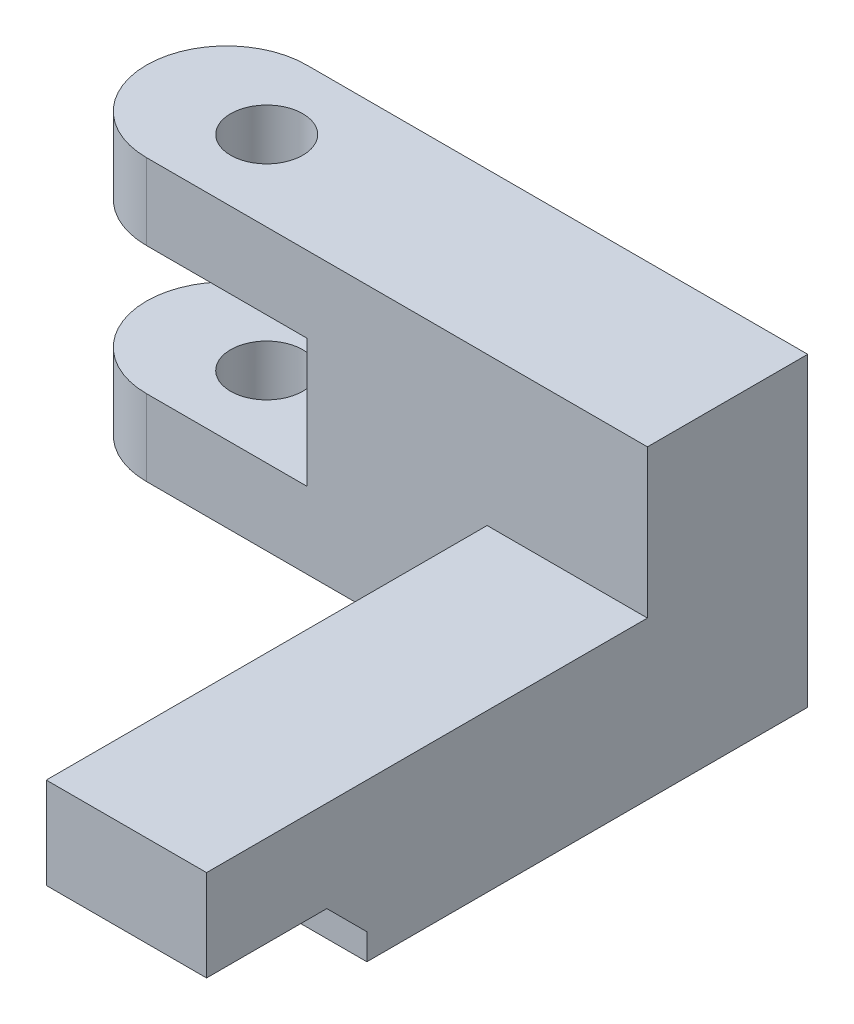
ISO-10303-21;
HEADER;
FILE_DESCRIPTION(('STEP AP214'),'2;1');
FILE_NAME('part.step','',(''),(''),'','','');
FILE_SCHEMA(('AUTOMOTIVE_DESIGN { 1 0 10303 214 1 1 1 1 }'));
ENDSEC;
DATA;
#1=APPLICATION_CONTEXT('core data for automotive mechanical design processes');
#2=APPLICATION_PROTOCOL_DEFINITION('international standard','automotive_design',2000,#1);
#3=PRODUCT_CONTEXT('',#1,'mechanical');
#4=PRODUCT('Part','Part','',(#3));
#5=PRODUCT_RELATED_PRODUCT_CATEGORY('part','',(#4));
#6=PRODUCT_DEFINITION_FORMATION('','',#4);
#7=PRODUCT_DEFINITION_CONTEXT('part definition',#1,'design');
#8=PRODUCT_DEFINITION('design','',#6,#7);
#9=PRODUCT_DEFINITION_SHAPE('','',#8);
#10=(LENGTH_UNIT() NAMED_UNIT(*) SI_UNIT(.MILLI.,.METRE.));
#11=(NAMED_UNIT(*) PLANE_ANGLE_UNIT() SI_UNIT($,.RADIAN.));
#12=(NAMED_UNIT(*) SI_UNIT($,.STERADIAN.) SOLID_ANGLE_UNIT());
#13=UNCERTAINTY_MEASURE_WITH_UNIT(LENGTH_MEASURE(1.E-05),#10,'distance_accuracy_value','');
#14=(GEOMETRIC_REPRESENTATION_CONTEXT(3) GLOBAL_UNCERTAINTY_ASSIGNED_CONTEXT((#13)) GLOBAL_UNIT_ASSIGNED_CONTEXT((#10,
#11,#12)) REPRESENTATION_CONTEXT('',''));
#15=CARTESIAN_POINT('',(0.,0.,0.));
#16=DIRECTION('',(0.,0.,1.));
#17=DIRECTION('',(1.,0.,0.));
#18=AXIS2_PLACEMENT_3D('',#15,#16,#17);
#19=CARTESIAN_POINT('',(1.49694147533203,7.,2.));
#20=DIRECTION('',(0.,-1.,0.));
#21=DIRECTION('',(0.,0.,-1.));
#22=AXIS2_PLACEMENT_3D('',#19,#20,#21);
#23=CYLINDRICAL_SURFACE('',#22,2.);
#24=DIRECTION('',(0.,-1.,0.));
#25=VECTOR('',#24,1.);
#26=CARTESIAN_POINT('',(1.49694147533203,7.,0.));
#27=LINE('',#26,#25);
#28=CARTESIAN_POINT('',(1.49694147533203,7.,0.));
#29=VERTEX_POINT('',#28);
#30=CARTESIAN_POINT('',(1.49694147533203,5.1,0.));
#31=VERTEX_POINT('',#30);
#32=EDGE_CURVE('E256',#29,#31,#27,.T.);
#33=ORIENTED_EDGE('',*,*,#32,.T.);
#34=CARTESIAN_POINT('',(1.49694147533203,5.1,2.));
#35=DIRECTION('',(0.,1.,0.));
#36=DIRECTION('',(-1.,0.,0.));
#37=AXIS2_PLACEMENT_3D('',#34,#35,#36);
#38=CIRCLE('',#37,2.);
#39=CARTESIAN_POINT('',(1.49694147533203,5.1,4.));
#40=VERTEX_POINT('',#39);
#41=EDGE_CURVE('E205',#40,#31,#38,.F.);
#42=ORIENTED_EDGE('',*,*,#41,.F.);
#43=DIRECTION('',(0.,-1.,0.));
#44=VECTOR('',#43,1.);
#45=CARTESIAN_POINT('',(1.49694147533203,7.,4.));
#46=LINE('',#45,#44);
#47=CARTESIAN_POINT('',(1.49694147533203,7.,4.));
#48=VERTEX_POINT('',#47);
#49=EDGE_CURVE('E43',#48,#40,#46,.T.);
#50=ORIENTED_EDGE('',*,*,#49,.F.);
#51=CARTESIAN_POINT('',(1.49694147533203,7.,2.));
#52=DIRECTION('',(0.,1.,0.));
#53=DIRECTION('',(0.,0.,-1.));
#54=AXIS2_PLACEMENT_3D('',#51,#52,#53);
#55=CIRCLE('',#54,2.);
#56=EDGE_CURVE('E239',#29,#48,#55,.T.);
#57=ORIENTED_EDGE('',*,*,#56,.F.);
#58=EDGE_LOOP('',(#33,#42,#50,#57));
#59=FACE_BOUND('',#58,.T.);
#60=ADVANCED_FACE('F39',(#59),#23,.T.);
#61=CARTESIAN_POINT('',(2.49694147533203,7.,2.));
#62=DIRECTION('',(0.,-1.,0.));
#63=DIRECTION('',(0.,0.,-1.));
#64=AXIS2_PLACEMENT_3D('',#61,#62,#63);
#65=CYLINDRICAL_SURFACE('',#64,0.9);
#66=CARTESIAN_POINT('',(2.49694147533203,5.1,2.));
#67=DIRECTION('',(0.,1.,0.));
#68=DIRECTION('',(-1.,0.,0.));
#69=AXIS2_PLACEMENT_3D('',#66,#67,#68);
#70=CIRCLE('',#69,0.9);
#71=CARTESIAN_POINT('',(1.59694147533203,5.1,2.));
#72=VERTEX_POINT('',#71);
#73=EDGE_CURVE('E208',#72,#72,#70,.F.);
#74=ORIENTED_EDGE('',*,*,#73,.T.);
#75=EDGE_LOOP('',(#74));
#76=FACE_BOUND('',#75,.T.);
#77=CARTESIAN_POINT('',(2.49694147533203,7.,2.));
#78=DIRECTION('',(0.,1.,0.));
#79=DIRECTION('',(0.,0.,1.));
#80=AXIS2_PLACEMENT_3D('',#77,#78,#79);
#81=CIRCLE('',#80,0.9);
#82=CARTESIAN_POINT('',(2.49694147533203,7.,2.9));
#83=VERTEX_POINT('',#82);
#84=EDGE_CURVE('E233',#83,#83,#81,.T.);
#85=ORIENTED_EDGE('',*,*,#84,.T.);
#86=EDGE_LOOP('',(#85));
#87=FACE_BOUND('',#86,.T.);
#88=ADVANCED_FACE('F333',(#76,#87),#65,.F.);
#89=CARTESIAN_POINT('',(1.49694147533203,7.,2.));
#90=DIRECTION('',(0.,-1.,0.));
#91=DIRECTION('',(0.,0.,-1.));
#92=AXIS2_PLACEMENT_3D('',#89,#90,#91);
#93=PLANE('',#92);
#94=DIRECTION('',(1.,0.,0.));
#95=VECTOR('',#94,1.);
#96=CARTESIAN_POINT('',(1.49694147533203,7.,4.));
#97=LINE('',#96,#95);
#98=CARTESIAN_POINT('',(13.996941475332,7.,4.));
#99=VERTEX_POINT('',#98);
#100=EDGE_CURVE('E242',#48,#99,#97,.T.);
#101=ORIENTED_EDGE('',*,*,#100,.T.);
#102=DIRECTION('',(0.,0.,-1.));
#103=VECTOR('',#102,1.);
#104=CARTESIAN_POINT('',(13.996941475332,7.,0.));
#105=LINE('',#104,#103);
#106=CARTESIAN_POINT('',(13.996941475332,7.,0.));
#107=VERTEX_POINT('',#106);
#108=EDGE_CURVE('E245',#99,#107,#105,.T.);
#109=ORIENTED_EDGE('',*,*,#108,.T.);
#110=DIRECTION('',(-1.,0.,0.));
#111=VECTOR('',#110,1.);
#112=CARTESIAN_POINT('',(1.49694147533203,7.,0.));
#113=LINE('',#112,#111);
#114=EDGE_CURVE('E247',#107,#29,#113,.T.);
#115=ORIENTED_EDGE('',*,*,#114,.T.);
#116=ORIENTED_EDGE('',*,*,#56,.T.);
#117=EDGE_LOOP('',(#101,#109,#115,#116));
#118=FACE_BOUND('',#117,.T.);
#119=ORIENTED_EDGE('',*,*,#84,.F.);
#120=EDGE_LOOP('',(#119));
#121=FACE_BOUND('',#120,.T.);
#122=ADVANCED_FACE('F313',(#118,#121),#93,.F.);
#123=CARTESIAN_POINT('',(1.49694147533203,0.,2.));
#124=DIRECTION('',(0.,-1.,0.));
#125=DIRECTION('',(0.,0.,-1.));
#126=AXIS2_PLACEMENT_3D('',#123,#124,#125);
#127=PLANE('',#126);
#128=DIRECTION('',(0.,0.,-1.));
#129=VECTOR('',#128,1.);
#130=CARTESIAN_POINT('',(9.99694147533202,0.,0.));
#131=LINE('',#130,#129);
#132=CARTESIAN_POINT('',(9.99694147533203,0.,4.));
#133=VERTEX_POINT('',#132);
#134=CARTESIAN_POINT('',(9.99694147533202,0.,0.));
#135=VERTEX_POINT('',#134);
#136=EDGE_CURVE('E11',#133,#135,#131,.T.);
#137=ORIENTED_EDGE('',*,*,#136,.F.);
#138=DIRECTION('',(1.,0.,0.));
#139=VECTOR('',#138,1.);
#140=CARTESIAN_POINT('',(1.49694147533203,0.,4.));
#141=LINE('',#140,#139);
#142=CARTESIAN_POINT('',(1.49694147533203,0.,4.));
#143=VERTEX_POINT('',#142);
#144=EDGE_CURVE('E252',#143,#133,#141,.T.);
#145=ORIENTED_EDGE('',*,*,#144,.F.);
#146=CARTESIAN_POINT('',(1.49694147533203,0.,2.));
#147=DIRECTION('',(0.,1.,0.));
#148=DIRECTION('',(0.,0.,-1.));
#149=AXIS2_PLACEMENT_3D('',#146,#147,#148);
#150=CIRCLE('',#149,2.);
#151=CARTESIAN_POINT('',(1.49694147533203,0.,0.));
#152=VERTEX_POINT('',#151);
#153=EDGE_CURVE('E236',#152,#143,#150,.T.);
#154=ORIENTED_EDGE('',*,*,#153,.F.);
#155=DIRECTION('',(-1.,0.,0.));
#156=VECTOR('',#155,1.);
#157=CARTESIAN_POINT('',(1.49694147533203,0.,0.));
#158=LINE('',#157,#156);
#159=EDGE_CURVE('E243',#135,#152,#158,.T.);
#160=ORIENTED_EDGE('',*,*,#159,.F.);
#161=EDGE_LOOP('',(#137,#145,#154,#160));
#162=FACE_BOUND('',#161,.T.);
#163=CARTESIAN_POINT('',(2.49694147533203,0.,2.));
#164=DIRECTION('',(0.,1.,0.));
#165=DIRECTION('',(0.,0.,1.));
#166=AXIS2_PLACEMENT_3D('',#163,#164,#165);
#167=CIRCLE('',#166,0.9);
#168=CARTESIAN_POINT('',(2.49694147533203,0.,2.9));
#169=VERTEX_POINT('',#168);
#170=EDGE_CURVE('E232',#169,#169,#167,.T.);
#171=ORIENTED_EDGE('',*,*,#170,.T.);
#172=EDGE_LOOP('',(#171));
#173=FACE_BOUND('',#172,.T.);
#174=ADVANCED_FACE('F302',(#162,#173),#127,.T.);
#175=CARTESIAN_POINT('',(1.49694147533203,1.9,4.));
#176=VERTEX_POINT('',#175);
#177=EDGE_CURVE('E268',#176,#143,#46,.T.);
#178=ORIENTED_EDGE('',*,*,#177,.F.);
#179=CARTESIAN_POINT('',(1.49694147533203,1.9,2.));
#180=DIRECTION('',(0.,-1.,0.));
#181=DIRECTION('',(1.,0.,0.));
#182=AXIS2_PLACEMENT_3D('',#179,#180,#181);
#183=CIRCLE('',#182,2.);
#184=CARTESIAN_POINT('',(1.49694147533203,1.9,0.));
#185=VERTEX_POINT('',#184);
#186=EDGE_CURVE('E202',#185,#176,#183,.F.);
#187=ORIENTED_EDGE('',*,*,#186,.F.);
#188=EDGE_CURVE('E249',#185,#152,#27,.T.);
#189=ORIENTED_EDGE('',*,*,#188,.T.);
#190=ORIENTED_EDGE('',*,*,#153,.T.);
#191=EDGE_LOOP('',(#178,#187,#189,#190));
#192=FACE_BOUND('',#191,.T.);
#193=ADVANCED_FACE('F41',(#192),#23,.T.);
#194=CARTESIAN_POINT('',(1.49694147533203,7.,4.));
#195=DIRECTION('',(0.,0.,-1.));
#196=DIRECTION('',(-1.,0.,0.));
#197=AXIS2_PLACEMENT_3D('',#194,#195,#196);
#198=PLANE('',#197);
#199=ORIENTED_EDGE('',*,*,#49,.T.);
#200=DIRECTION('',(-1.,0.,0.));
#201=VECTOR('',#200,1.);
#202=CARTESIAN_POINT('',(-0.503058524667974,5.1,4.));
#203=LINE('',#202,#201);
#204=CARTESIAN_POINT('',(5.49694147533203,5.1,4.));
#205=VERTEX_POINT('',#204);
#206=EDGE_CURVE('E222',#205,#40,#203,.T.);
#207=ORIENTED_EDGE('',*,*,#206,.F.);
#208=DIRECTION('',(0.,1.,0.));
#209=VECTOR('',#208,1.);
#210=CARTESIAN_POINT('',(5.49694147533203,1.9,4.));
#211=LINE('',#210,#209);
#212=CARTESIAN_POINT('',(5.49694147533203,1.9,4.));
#213=VERTEX_POINT('',#212);
#214=EDGE_CURVE('E219',#213,#205,#211,.T.);
#215=ORIENTED_EDGE('',*,*,#214,.F.);
#216=DIRECTION('',(1.,0.,0.));
#217=VECTOR('',#216,1.);
#218=CARTESIAN_POINT('',(-0.503058524667974,1.9,4.));
#219=LINE('',#218,#217);
#220=EDGE_CURVE('E216',#176,#213,#219,.T.);
#221=ORIENTED_EDGE('',*,*,#220,.F.);
#222=ORIENTED_EDGE('',*,*,#177,.T.);
#223=ORIENTED_EDGE('',*,*,#144,.T.);
#224=DIRECTION('',(0.,-1.,0.));
#225=VECTOR('',#224,1.);
#226=CARTESIAN_POINT('',(9.99694147533203,7.,4.));
#227=LINE('',#226,#225);
#228=CARTESIAN_POINT('',(9.99694147533203,3.3,4.));
#229=VERTEX_POINT('',#228);
#230=EDGE_CURVE('E266',#229,#133,#227,.T.);
#231=ORIENTED_EDGE('',*,*,#230,.F.);
#232=DIRECTION('',(1.,0.,0.));
#233=VECTOR('',#232,1.);
#234=CARTESIAN_POINT('',(9.99694147533203,3.3,4.));
#235=LINE('',#234,#233);
#236=CARTESIAN_POINT('',(13.996941475332,3.3,4.));
#237=VERTEX_POINT('',#236);
#238=EDGE_CURVE('E200',#229,#237,#235,.T.);
#239=ORIENTED_EDGE('',*,*,#238,.T.);
#240=DIRECTION('',(0.,1.,0.));
#241=VECTOR('',#240,1.);
#242=CARTESIAN_POINT('',(13.996941475332,7.,4.));
#243=LINE('',#242,#241);
#244=EDGE_CURVE('E196',#237,#99,#243,.T.);
#245=ORIENTED_EDGE('',*,*,#244,.T.);
#246=ORIENTED_EDGE('',*,*,#100,.F.);
#247=EDGE_LOOP('',(#199,#207,#215,#221,#222,#223,#231,#239,#245,#246));
#248=FACE_BOUND('',#247,.T.);
#249=ADVANCED_FACE('F277',(#248),#198,.F.);
#250=CARTESIAN_POINT('',(9.99694147533203,7.,4.));
#251=DIRECTION('',(1.,0.,0.));
#252=DIRECTION('',(0.,0.,-1.));
#253=AXIS2_PLACEMENT_3D('',#250,#251,#252);
#254=PLANE('',#253);
#255=DIRECTION('',(0.,0.,-1.));
#256=VECTOR('',#255,1.);
#257=CARTESIAN_POINT('',(9.99694147533202,-0.6275,0.));
#258=LINE('',#257,#256);
#259=CARTESIAN_POINT('',(9.99694147533203,-0.6275,11.));
#260=VERTEX_POINT('',#259);
#261=CARTESIAN_POINT('',(9.99694147533202,-0.6275,0.));
#262=VERTEX_POINT('',#261);
#263=EDGE_CURVE('E169',#260,#262,#258,.T.);
#264=ORIENTED_EDGE('',*,*,#263,.F.);
#265=DIRECTION('',(0.,-1.,0.));
#266=VECTOR('',#265,1.);
#267=CARTESIAN_POINT('',(9.99694147533203,-0.6275,11.));
#268=LINE('',#267,#266);
#269=CARTESIAN_POINT('',(9.99694147533203,0.0225000000000096,11.));
#270=VERTEX_POINT('',#269);
#271=EDGE_CURVE('E55',#270,#260,#268,.T.);
#272=ORIENTED_EDGE('',*,*,#271,.F.);
#273=DIRECTION('',(0.,-0.707106781186544,-0.707106781186551));
#274=VECTOR('',#273,1.);
#275=CARTESIAN_POINT('',(9.99694147533203,0.0225000000000081,11.));
#276=LINE('',#275,#274);
#277=CARTESIAN_POINT('',(9.99694147533202,1.0225,12.));
#278=VERTEX_POINT('',#277);
#279=EDGE_CURVE('E158',#278,#270,#276,.T.);
#280=ORIENTED_EDGE('',*,*,#279,.F.);
#281=DIRECTION('',(0.,0.,-1.));
#282=VECTOR('',#281,1.);
#283=CARTESIAN_POINT('',(9.99694147533203,1.0225,15.));
#284=LINE('',#283,#282);
#285=CARTESIAN_POINT('',(9.99694147533202,1.0225,15.));
#286=VERTEX_POINT('',#285);
#287=EDGE_CURVE('E170',#286,#278,#284,.T.);
#288=ORIENTED_EDGE('',*,*,#287,.F.);
#289=DIRECTION('',(0.,-1.,0.));
#290=VECTOR('',#289,1.);
#291=CARTESIAN_POINT('',(9.99694147533203,7.,15.));
#292=LINE('',#291,#290);
#293=CARTESIAN_POINT('',(9.99694147533202,3.3,15.));
#294=VERTEX_POINT('',#293);
#295=EDGE_CURVE('E264',#294,#286,#292,.T.);
#296=ORIENTED_EDGE('',*,*,#295,.F.);
#297=DIRECTION('',(0.,0.,-1.));
#298=VECTOR('',#297,1.);
#299=CARTESIAN_POINT('',(9.99694147533202,3.3,15.));
#300=LINE('',#299,#298);
#301=EDGE_CURVE('E193',#294,#229,#300,.T.);
#302=ORIENTED_EDGE('',*,*,#301,.T.);
#303=ORIENTED_EDGE('',*,*,#230,.T.);
#304=ORIENTED_EDGE('',*,*,#136,.T.);
#305=DIRECTION('',(0.,1.,0.));
#306=VECTOR('',#305,1.);
#307=CARTESIAN_POINT('',(9.99694147533202,-0.6275,0.));
#308=LINE('',#307,#306);
#309=EDGE_CURVE('E188',#262,#135,#308,.T.);
#310=ORIENTED_EDGE('',*,*,#309,.F.);
#311=EDGE_LOOP('',(#264,#272,#280,#288,#296,#302,#303,#304,#310));
#312=FACE_BOUND('',#311,.T.);
#313=ADVANCED_FACE('F167',(#312),#254,.F.);
#314=CARTESIAN_POINT('',(9.99694147533203,7.,15.));
#315=DIRECTION('',(0.,0.,-1.));
#316=DIRECTION('',(-1.,0.,0.));
#317=AXIS2_PLACEMENT_3D('',#314,#315,#316);
#318=PLANE('',#317);
#319=ORIENTED_EDGE('',*,*,#295,.T.);
#320=DIRECTION('',(1.,0.,0.));
#321=VECTOR('',#320,1.);
#322=CARTESIAN_POINT('',(-0.504058524667976,1.0225,15.));
#323=LINE('',#322,#321);
#324=CARTESIAN_POINT('',(13.996941475332,1.0225,15.));
#325=VERTEX_POINT('',#324);
#326=EDGE_CURVE('E179',#286,#325,#323,.T.);
#327=ORIENTED_EDGE('',*,*,#326,.T.);
#328=DIRECTION('',(0.,-1.,0.));
#329=VECTOR('',#328,1.);
#330=CARTESIAN_POINT('',(13.996941475332,7.,15.));
#331=LINE('',#330,#329);
#332=CARTESIAN_POINT('',(13.996941475332,3.3,15.));
#333=VERTEX_POINT('',#332);
#334=EDGE_CURVE('E261',#333,#325,#331,.T.);
#335=ORIENTED_EDGE('',*,*,#334,.F.);
#336=DIRECTION('',(1.,0.,0.));
#337=VECTOR('',#336,1.);
#338=CARTESIAN_POINT('',(9.99694147533202,3.3,15.));
#339=LINE('',#338,#337);
#340=EDGE_CURVE('E63',#294,#333,#339,.T.);
#341=ORIENTED_EDGE('',*,*,#340,.F.);
#342=EDGE_LOOP('',(#319,#327,#335,#341));
#343=FACE_BOUND('',#342,.T.);
#344=ADVANCED_FACE('F322',(#343),#318,.F.);
#345=CARTESIAN_POINT('',(13.996941475332,7.,0.));
#346=DIRECTION('',(-1.,0.,0.));
#347=DIRECTION('',(0.,0.,1.));
#348=AXIS2_PLACEMENT_3D('',#345,#346,#347);
#349=PLANE('',#348);
#350=DIRECTION('',(0.,0.707106781186544,0.707106781186551));
#351=VECTOR('',#350,1.);
#352=CARTESIAN_POINT('',(13.996941475332,0.0225000000000096,11.));
#353=LINE('',#352,#351);
#354=CARTESIAN_POINT('',(13.996941475332,0.0225000000000096,11.));
#355=VERTEX_POINT('',#354);
#356=CARTESIAN_POINT('',(13.996941475332,1.0225,12.));
#357=VERTEX_POINT('',#356);
#358=EDGE_CURVE('E172',#355,#357,#353,.T.);
#359=ORIENTED_EDGE('',*,*,#358,.F.);
#360=DIRECTION('',(0.,1.,0.));
#361=VECTOR('',#360,1.);
#362=CARTESIAN_POINT('',(13.996941475332,-0.6275,11.));
#363=LINE('',#362,#361);
#364=CARTESIAN_POINT('',(13.996941475332,-0.6275,11.));
#365=VERTEX_POINT('',#364);
#366=EDGE_CURVE('E150',#365,#355,#363,.T.);
#367=ORIENTED_EDGE('',*,*,#366,.F.);
#368=DIRECTION('',(0.,0.,1.));
#369=VECTOR('',#368,1.);
#370=CARTESIAN_POINT('',(13.996941475332,-0.6275,0.));
#371=LINE('',#370,#369);
#372=CARTESIAN_POINT('',(13.996941475332,-0.6275,0.));
#373=VERTEX_POINT('',#372);
#374=EDGE_CURVE('E163',#373,#365,#371,.T.);
#375=ORIENTED_EDGE('',*,*,#374,.F.);
#376=DIRECTION('',(0.,-1.,0.));
#377=VECTOR('',#376,1.);
#378=CARTESIAN_POINT('',(13.996941475332,7.,0.));
#379=LINE('',#378,#377);
#380=EDGE_CURVE('E259',#107,#373,#379,.T.);
#381=ORIENTED_EDGE('',*,*,#380,.F.);
#382=ORIENTED_EDGE('',*,*,#108,.F.);
#383=ORIENTED_EDGE('',*,*,#244,.F.);
#384=DIRECTION('',(0.,0.,-1.));
#385=VECTOR('',#384,1.);
#386=CARTESIAN_POINT('',(13.996941475332,3.3,15.));
#387=LINE('',#386,#385);
#388=EDGE_CURVE('E192',#333,#237,#387,.T.);
#389=ORIENTED_EDGE('',*,*,#388,.F.);
#390=ORIENTED_EDGE('',*,*,#334,.T.);
#391=DIRECTION('',(0.,0.,1.));
#392=VECTOR('',#391,1.);
#393=CARTESIAN_POINT('',(13.996941475332,1.0225,15.));
#394=LINE('',#393,#392);
#395=EDGE_CURVE('E155',#357,#325,#394,.T.);
#396=ORIENTED_EDGE('',*,*,#395,.F.);
#397=EDGE_LOOP('',(#359,#367,#375,#381,#382,#383,#389,#390,#396));
#398=FACE_BOUND('',#397,.T.);
#399=ADVANCED_FACE('F309',(#398),#349,.F.);
#400=CARTESIAN_POINT('',(1.49694147533203,7.,0.));
#401=DIRECTION('',(0.,0.,1.));
#402=DIRECTION('',(1.,0.,0.));
#403=AXIS2_PLACEMENT_3D('',#400,#401,#402);
#404=PLANE('',#403);
#405=DIRECTION('',(0.,-1.,0.));
#406=VECTOR('',#405,1.);
#407=CARTESIAN_POINT('',(5.49694147533203,1.9,0.));
#408=LINE('',#407,#406);
#409=CARTESIAN_POINT('',(5.49694147533203,5.1,0.));
#410=VERTEX_POINT('',#409);
#411=CARTESIAN_POINT('',(5.49694147533203,1.9,0.));
#412=VERTEX_POINT('',#411);
#413=EDGE_CURVE('E211',#410,#412,#408,.T.);
#414=ORIENTED_EDGE('',*,*,#413,.F.);
#415=DIRECTION('',(1.,0.,0.));
#416=VECTOR('',#415,1.);
#417=CARTESIAN_POINT('',(-0.503058524667974,5.1,0.));
#418=LINE('',#417,#416);
#419=EDGE_CURVE('E213',#31,#410,#418,.T.);
#420=ORIENTED_EDGE('',*,*,#419,.F.);
#421=ORIENTED_EDGE('',*,*,#32,.F.);
#422=ORIENTED_EDGE('',*,*,#114,.F.);
#423=ORIENTED_EDGE('',*,*,#380,.T.);
#424=DIRECTION('',(1.,0.,0.));
#425=VECTOR('',#424,1.);
#426=CARTESIAN_POINT('',(13.996941475332,-0.6275,0.));
#427=LINE('',#426,#425);
#428=EDGE_CURVE('E186',#262,#373,#427,.T.);
#429=ORIENTED_EDGE('',*,*,#428,.F.);
#430=ORIENTED_EDGE('',*,*,#309,.T.);
#431=ORIENTED_EDGE('',*,*,#159,.T.);
#432=ORIENTED_EDGE('',*,*,#188,.F.);
#433=DIRECTION('',(-1.,0.,0.));
#434=VECTOR('',#433,1.);
#435=CARTESIAN_POINT('',(-0.503058524667974,1.9,0.));
#436=LINE('',#435,#434);
#437=EDGE_CURVE('E227',#412,#185,#436,.T.);
#438=ORIENTED_EDGE('',*,*,#437,.F.);
#439=EDGE_LOOP('',(#414,#420,#421,#422,#423,#429,#430,#431,#432,#438));
#440=FACE_BOUND('',#439,.T.);
#441=ADVANCED_FACE('F288',(#440),#404,.F.);
#442=CARTESIAN_POINT('',(2.49694147533203,1.9,2.));
#443=DIRECTION('',(0.,-1.,0.));
#444=DIRECTION('',(1.,0.,0.));
#445=AXIS2_PLACEMENT_3D('',#442,#443,#444);
#446=CIRCLE('',#445,0.9);
#447=CARTESIAN_POINT('',(3.39694147533203,1.9,2.));
#448=VERTEX_POINT('',#447);
#449=EDGE_CURVE('E207',#448,#448,#446,.F.);
#450=ORIENTED_EDGE('',*,*,#449,.T.);
#451=EDGE_LOOP('',(#450));
#452=FACE_BOUND('',#451,.T.);
#453=ORIENTED_EDGE('',*,*,#170,.F.);
#454=EDGE_LOOP('',(#453));
#455=FACE_BOUND('',#454,.T.);
#456=ADVANCED_FACE('F339',(#452,#455),#65,.F.);
#457=CARTESIAN_POINT('',(-0.503058524667974,5.1,-0.00100000000000707));
#458=DIRECTION('',(0.,1.,0.));
#459=DIRECTION('',(-1.,0.,0.));
#460=AXIS2_PLACEMENT_3D('',#457,#458,#459);
#461=PLANE('',#460);
#462=ORIENTED_EDGE('',*,*,#73,.F.);
#463=EDGE_LOOP('',(#462));
#464=FACE_BOUND('',#463,.T.);
#465=ORIENTED_EDGE('',*,*,#41,.T.);
#466=ORIENTED_EDGE('',*,*,#419,.T.);
#467=DIRECTION('',(0.,0.,1.));
#468=VECTOR('',#467,1.);
#469=CARTESIAN_POINT('',(5.49694147533203,5.1,-0.00100000000000707));
#470=LINE('',#469,#468);
#471=EDGE_CURVE('E225',#410,#205,#470,.T.);
#472=ORIENTED_EDGE('',*,*,#471,.T.);
#473=ORIENTED_EDGE('',*,*,#206,.T.);
#474=EDGE_LOOP('',(#465,#466,#472,#473));
#475=FACE_BOUND('',#474,.T.);
#476=ADVANCED_FACE('F285',(#464,#475),#461,.F.);
#477=CARTESIAN_POINT('',(5.49694147533203,1.9,-0.00100000000000707));
#478=DIRECTION('',(1.,0.,0.));
#479=DIRECTION('',(0.,0.,-1.));
#480=AXIS2_PLACEMENT_3D('',#477,#478,#479);
#481=PLANE('',#480);
#482=ORIENTED_EDGE('',*,*,#413,.T.);
#483=DIRECTION('',(0.,0.,1.));
#484=VECTOR('',#483,1.);
#485=CARTESIAN_POINT('',(5.49694147533203,1.9,-0.00100000000000707));
#486=LINE('',#485,#484);
#487=EDGE_CURVE('E224',#412,#213,#486,.T.);
#488=ORIENTED_EDGE('',*,*,#487,.T.);
#489=ORIENTED_EDGE('',*,*,#214,.T.);
#490=ORIENTED_EDGE('',*,*,#471,.F.);
#491=EDGE_LOOP('',(#482,#488,#489,#490));
#492=FACE_BOUND('',#491,.T.);
#493=ADVANCED_FACE('F294',(#492),#481,.F.);
#494=CARTESIAN_POINT('',(-0.503058524667974,1.9,-0.00100000000000707));
#495=DIRECTION('',(0.,-1.,0.));
#496=DIRECTION('',(1.,0.,0.));
#497=AXIS2_PLACEMENT_3D('',#494,#495,#496);
#498=PLANE('',#497);
#499=ORIENTED_EDGE('',*,*,#449,.F.);
#500=EDGE_LOOP('',(#499));
#501=FACE_BOUND('',#500,.T.);
#502=ORIENTED_EDGE('',*,*,#186,.T.);
#503=ORIENTED_EDGE('',*,*,#220,.T.);
#504=ORIENTED_EDGE('',*,*,#487,.F.);
#505=ORIENTED_EDGE('',*,*,#437,.T.);
#506=EDGE_LOOP('',(#502,#503,#504,#505));
#507=FACE_BOUND('',#506,.T.);
#508=ADVANCED_FACE('F296',(#501,#507),#498,.F.);
#509=CARTESIAN_POINT('',(9.99694147533202,3.3,15.));
#510=DIRECTION('',(0.,-1.,0.));
#511=DIRECTION('',(0.,0.,-1.));
#512=AXIS2_PLACEMENT_3D('',#509,#510,#511);
#513=PLANE('',#512);
#514=ORIENTED_EDGE('',*,*,#388,.T.);
#515=ORIENTED_EDGE('',*,*,#238,.F.);
#516=ORIENTED_EDGE('',*,*,#301,.F.);
#517=ORIENTED_EDGE('',*,*,#340,.T.);
#518=EDGE_LOOP('',(#514,#515,#516,#517));
#519=FACE_BOUND('',#518,.T.);
#520=ADVANCED_FACE('F306',(#519),#513,.F.);
#521=CARTESIAN_POINT('',(0.,-0.6275,0.));
#522=DIRECTION('',(0.,-1.,0.));
#523=DIRECTION('',(0.,0.,-1.));
#524=AXIS2_PLACEMENT_3D('',#521,#522,#523);
#525=PLANE('',#524);
#526=DIRECTION('',(1.,0.,0.));
#527=VECTOR('',#526,1.);
#528=CARTESIAN_POINT('',(-0.504058524667976,-0.6275,11.));
#529=LINE('',#528,#527);
#530=EDGE_CURVE('E164',#260,#365,#529,.T.);
#531=ORIENTED_EDGE('',*,*,#530,.F.);
#532=ORIENTED_EDGE('',*,*,#263,.T.);
#533=ORIENTED_EDGE('',*,*,#428,.T.);
#534=ORIENTED_EDGE('',*,*,#374,.T.);
#535=EDGE_LOOP('',(#531,#532,#533,#534));
#536=FACE_BOUND('',#535,.T.);
#537=ADVANCED_FACE('F317',(#536),#525,.T.);
#538=CARTESIAN_POINT('',(-0.504058524667976,-0.6275,11.));
#539=DIRECTION('',(0.,0.,-1.));
#540=DIRECTION('',(-1.,0.,0.));
#541=AXIS2_PLACEMENT_3D('',#538,#539,#540);
#542=PLANE('',#541);
#543=ORIENTED_EDGE('',*,*,#271,.T.);
#544=ORIENTED_EDGE('',*,*,#530,.T.);
#545=ORIENTED_EDGE('',*,*,#366,.T.);
#546=DIRECTION('',(1.,0.,0.));
#547=VECTOR('',#546,1.);
#548=CARTESIAN_POINT('',(-0.504058524667976,0.0225000000000096,11.));
#549=LINE('',#548,#547);
#550=EDGE_CURVE('E146',#270,#355,#549,.T.);
#551=ORIENTED_EDGE('',*,*,#550,.F.);
#552=EDGE_LOOP('',(#543,#544,#545,#551));
#553=FACE_BOUND('',#552,.T.);
#554=ADVANCED_FACE('F148',(#553),#542,.F.);
#555=CARTESIAN_POINT('',(-0.504058524667976,1.0225,15.));
#556=DIRECTION('',(0.,1.,0.));
#557=DIRECTION('',(0.,0.,1.));
#558=AXIS2_PLACEMENT_3D('',#555,#556,#557);
#559=PLANE('',#558);
#560=ORIENTED_EDGE('',*,*,#287,.T.);
#561=DIRECTION('',(1.,0.,0.));
#562=VECTOR('',#561,1.);
#563=CARTESIAN_POINT('',(-0.504058524667976,1.0225,12.));
#564=LINE('',#563,#562);
#565=EDGE_CURVE('E154',#278,#357,#564,.T.);
#566=ORIENTED_EDGE('',*,*,#565,.T.);
#567=ORIENTED_EDGE('',*,*,#395,.T.);
#568=ORIENTED_EDGE('',*,*,#326,.F.);
#569=EDGE_LOOP('',(#560,#566,#567,#568));
#570=FACE_BOUND('',#569,.T.);
#571=ADVANCED_FACE('F320',(#570),#559,.F.);
#572=CARTESIAN_POINT('',(-0.504058524667976,0.0225000000000096,11.));
#573=DIRECTION('',(0.,0.707106781186551,-0.707106781186544));
#574=DIRECTION('',(0.,0.707106781186544,0.707106781186551));
#575=AXIS2_PLACEMENT_3D('',#572,#573,#574);
#576=PLANE('',#575);
#577=ORIENTED_EDGE('',*,*,#279,.T.);
#578=ORIENTED_EDGE('',*,*,#550,.T.);
#579=ORIENTED_EDGE('',*,*,#358,.T.);
#580=ORIENTED_EDGE('',*,*,#565,.F.);
#581=EDGE_LOOP('',(#577,#578,#579,#580));
#582=FACE_BOUND('',#581,.T.);
#583=ADVANCED_FACE('F159',(#582),#576,.F.);
#584=CLOSED_SHELL('',(#60,#88,#122,#174,#193,#249,#313,#344,#399,#441,#456,#476,#493,#508,#520,
#537,#554,#571,#583));
#585=MANIFOLD_SOLID_BREP('B2',#584);
#586=ADVANCED_BREP_SHAPE_REPRESENTATION('',(#18,#585),#14);
#587=SHAPE_DEFINITION_REPRESENTATION(#9,#586);
ENDSEC;
END-ISO-10303-21;
